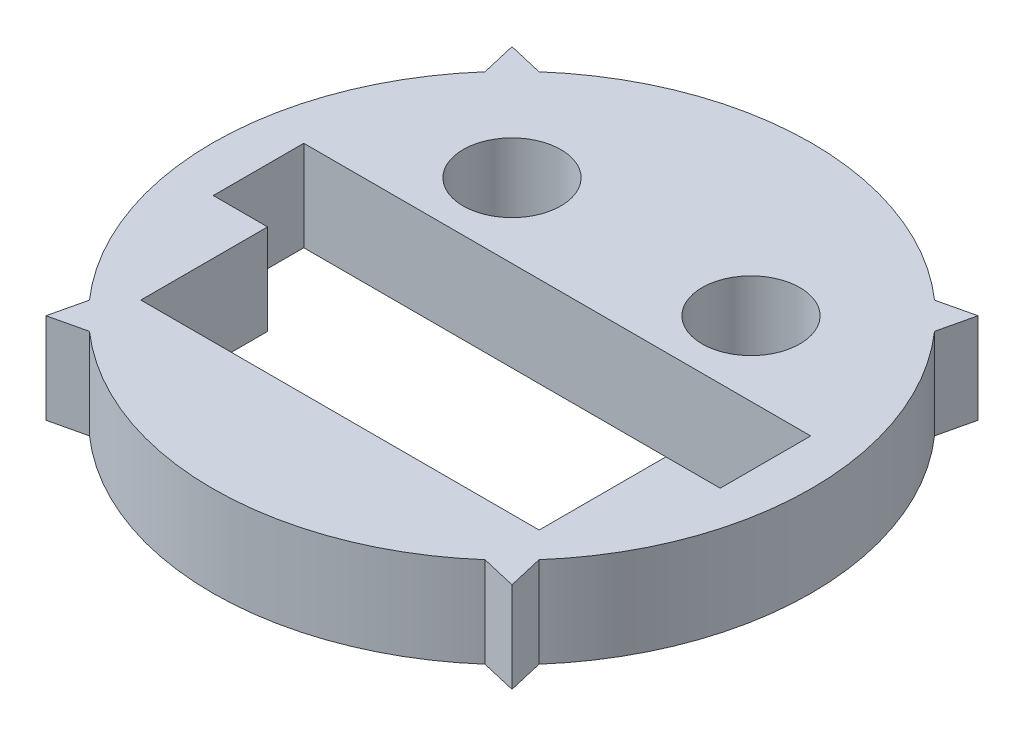
ISO-10303-21;
HEADER;
FILE_DESCRIPTION(('STEP AP214'),'2;1');
FILE_NAME('part.step','',(''),(''),'','','');
FILE_SCHEMA(('AUTOMOTIVE_DESIGN { 1 0 10303 214 1 1 1 1 }'));
ENDSEC;
DATA;
#1=APPLICATION_CONTEXT('core data for automotive mechanical design processes');
#2=APPLICATION_PROTOCOL_DEFINITION('international standard','automotive_design',2000,#1);
#3=PRODUCT_CONTEXT('',#1,'mechanical');
#4=PRODUCT('Part','Part','',(#3));
#5=PRODUCT_RELATED_PRODUCT_CATEGORY('part','',(#4));
#6=PRODUCT_DEFINITION_FORMATION('','',#4);
#7=PRODUCT_DEFINITION_CONTEXT('part definition',#1,'design');
#8=PRODUCT_DEFINITION('design','',#6,#7);
#9=PRODUCT_DEFINITION_SHAPE('','',#8);
#10=(LENGTH_UNIT() NAMED_UNIT(*) SI_UNIT(.MILLI.,.METRE.));
#11=(NAMED_UNIT(*) PLANE_ANGLE_UNIT() SI_UNIT($,.RADIAN.));
#12=(NAMED_UNIT(*) SI_UNIT($,.STERADIAN.) SOLID_ANGLE_UNIT());
#13=UNCERTAINTY_MEASURE_WITH_UNIT(LENGTH_MEASURE(1.E-05),#10,'distance_accuracy_value','');
#14=(GEOMETRIC_REPRESENTATION_CONTEXT(3) GLOBAL_UNCERTAINTY_ASSIGNED_CONTEXT((#13)) GLOBAL_UNIT_ASSIGNED_CONTEXT((#10,
#11,#12)) REPRESENTATION_CONTEXT('',''));
#15=CARTESIAN_POINT('',(0.,0.,0.));
#16=DIRECTION('',(0.,0.,1.));
#17=DIRECTION('',(1.,0.,0.));
#18=AXIS2_PLACEMENT_3D('',#15,#16,#17);
#19=CARTESIAN_POINT('',(0.,6.35,0.));
#20=DIRECTION('',(0.,1.,0.));
#21=DIRECTION('',(0.,0.,1.));
#22=AXIS2_PLACEMENT_3D('',#19,#20,#21);
#23=PLANE('',#22);
#24=CARTESIAN_POINT('',(-8.382,6.35,-8.382));
#25=DIRECTION('',(0.,1.,0.));
#26=DIRECTION('',(0.,0.,1.));
#27=AXIS2_PLACEMENT_3D('',#24,#25,#26);
#28=CIRCLE('',#27,3.429);
#29=CARTESIAN_POINT('',(-8.382,6.35,-4.953));
#30=VERTEX_POINT('',#29);
#31=EDGE_CURVE('E228',#30,#30,#28,.T.);
#32=ORIENTED_EDGE('',*,*,#31,.F.);
#33=EDGE_LOOP('',(#32));
#34=FACE_BOUND('',#33,.T.);
#35=CARTESIAN_POINT('',(0.,6.35,0.));
#36=DIRECTION('',(0.,1.,0.));
#37=DIRECTION('',(0.,0.,1.));
#38=AXIS2_PLACEMENT_3D('',#35,#36,#37);
#39=CIRCLE('',#38,21.);
#40=CARTESIAN_POINT('',(13.8700852365894,6.35,-15.767711803865));
#41=VERTEX_POINT('',#40);
#42=CARTESIAN_POINT('',(-13.8700852365893,6.35,-15.7677118038652));
#43=VERTEX_POINT('',#42);
#44=EDGE_CURVE('E258',#41,#43,#39,.T.);
#45=ORIENTED_EDGE('',*,*,#44,.T.);
#46=DIRECTION('',(-0.973932989200464,0.,-0.22683591546986));
#47=VECTOR('',#46,1.);
#48=CARTESIAN_POINT('',(-16.3438750291584,6.35,-16.3438750291586));
#49=LINE('',#48,#47);
#50=CARTESIAN_POINT('',(-16.3438750291584,6.35,-16.3438750291586));
#51=VERTEX_POINT('',#50);
#52=EDGE_CURVE('E263',#43,#51,#49,.T.);
#53=ORIENTED_EDGE('',*,*,#52,.T.);
#54=DIRECTION('',(0.22683591546985,0.,0.973932989200466));
#55=VECTOR('',#54,1.);
#56=CARTESIAN_POINT('',(-15.767711803865,6.35,-13.8700852365894));
#57=LINE('',#56,#55);
#58=CARTESIAN_POINT('',(-15.767711803865,6.35,-13.8700852365894));
#59=VERTEX_POINT('',#58);
#60=EDGE_CURVE('E275',#51,#59,#57,.T.);
#61=ORIENTED_EDGE('',*,*,#60,.T.);
#62=CARTESIAN_POINT('',(0.,6.35,0.));
#63=DIRECTION('',(0.,1.,0.));
#64=DIRECTION('',(0.,0.,1.));
#65=AXIS2_PLACEMENT_3D('',#62,#63,#64);
#66=CIRCLE('',#65,21.);
#67=CARTESIAN_POINT('',(-15.7677118038652,6.35,13.8700852365893));
#68=VERTEX_POINT('',#67);
#69=EDGE_CURVE('E278',#59,#68,#66,.T.);
#70=ORIENTED_EDGE('',*,*,#69,.T.);
#71=DIRECTION('',(-0.226835915469858,0.,0.973932989200464));
#72=VECTOR('',#71,1.);
#73=CARTESIAN_POINT('',(-16.3438750291586,6.35,16.3438750291584));
#74=LINE('',#73,#72);
#75=CARTESIAN_POINT('',(-16.3438750291586,6.35,16.3438750291584));
#76=VERTEX_POINT('',#75);
#77=EDGE_CURVE('E282',#68,#76,#74,.T.);
#78=ORIENTED_EDGE('',*,*,#77,.T.);
#79=DIRECTION('',(0.973932989200466,0.,-0.22683591546985));
#80=VECTOR('',#79,1.);
#81=CARTESIAN_POINT('',(-13.8700852365894,6.35,15.767711803865));
#82=LINE('',#81,#80);
#83=CARTESIAN_POINT('',(-13.8700852365894,6.35,15.767711803865));
#84=VERTEX_POINT('',#83);
#85=EDGE_CURVE('E286',#76,#84,#82,.T.);
#86=ORIENTED_EDGE('',*,*,#85,.T.);
#87=CARTESIAN_POINT('',(0.,6.35,0.));
#88=DIRECTION('',(0.,1.,0.));
#89=DIRECTION('',(0.,0.,1.));
#90=AXIS2_PLACEMENT_3D('',#87,#88,#89);
#91=CIRCLE('',#90,21.);
#92=CARTESIAN_POINT('',(13.8700852365893,6.35,15.7677118038652));
#93=VERTEX_POINT('',#92);
#94=EDGE_CURVE('E294',#84,#93,#91,.T.);
#95=ORIENTED_EDGE('',*,*,#94,.T.);
#96=DIRECTION('',(0.973932989200464,0.,0.226835915469859));
#97=VECTOR('',#96,1.);
#98=CARTESIAN_POINT('',(16.3438750291584,6.35,16.3438750291586));
#99=LINE('',#98,#97);
#100=CARTESIAN_POINT('',(16.3438750291584,6.35,16.3438750291586));
#101=VERTEX_POINT('',#100);
#102=EDGE_CURVE('E297',#93,#101,#99,.T.);
#103=ORIENTED_EDGE('',*,*,#102,.T.);
#104=DIRECTION('',(-0.226835915469849,0.,-0.973932989200466));
#105=VECTOR('',#104,1.);
#106=CARTESIAN_POINT('',(15.767711803865,6.35,13.8700852365894));
#107=LINE('',#106,#105);
#108=CARTESIAN_POINT('',(15.767711803865,6.35,13.8700852365894));
#109=VERTEX_POINT('',#108);
#110=EDGE_CURVE('E301',#101,#109,#107,.T.);
#111=ORIENTED_EDGE('',*,*,#110,.T.);
#112=CARTESIAN_POINT('',(0.,6.35,0.));
#113=DIRECTION('',(0.,1.,0.));
#114=DIRECTION('',(0.,0.,1.));
#115=AXIS2_PLACEMENT_3D('',#112,#113,#114);
#116=CIRCLE('',#115,21.);
#117=CARTESIAN_POINT('',(15.7677118038652,6.35,-13.8700852365893));
#118=VERTEX_POINT('',#117);
#119=EDGE_CURVE('E305',#109,#118,#116,.T.);
#120=ORIENTED_EDGE('',*,*,#119,.T.);
#121=DIRECTION('',(0.226835915469859,0.,-0.973932989200464));
#122=VECTOR('',#121,1.);
#123=CARTESIAN_POINT('',(16.3438750291586,6.35,-16.3438750291584));
#124=LINE('',#123,#122);
#125=CARTESIAN_POINT('',(16.3438750291586,6.35,-16.3438750291584));
#126=VERTEX_POINT('',#125);
#127=EDGE_CURVE('E309',#118,#126,#124,.T.);
#128=ORIENTED_EDGE('',*,*,#127,.T.);
#129=DIRECTION('',(-0.973932989200466,0.,0.226835915469849));
#130=VECTOR('',#129,1.);
#131=CARTESIAN_POINT('',(13.8700852365894,6.35,-15.767711803865));
#132=LINE('',#131,#130);
#133=EDGE_CURVE('E312',#126,#41,#132,.T.);
#134=ORIENTED_EDGE('',*,*,#133,.T.);
#135=EDGE_LOOP('',(#45,#53,#61,#70,#78,#86,#95,#103,#111,#120,#128,#134));
#136=FACE_BOUND('',#135,.T.);
#137=DIRECTION('',(1.,0.,0.));
#138=VECTOR('',#137,1.);
#139=CARTESIAN_POINT('',(-17.78,6.35,3.175));
#140=LINE('',#139,#138);
#141=CARTESIAN_POINT('',(-17.78,6.35,3.175));
#142=VERTEX_POINT('',#141);
#143=CARTESIAN_POINT('',(-13.97,6.35,3.175));
#144=VERTEX_POINT('',#143);
#145=EDGE_CURVE('E184',#142,#144,#140,.T.);
#146=ORIENTED_EDGE('',*,*,#145,.F.);
#147=DIRECTION('',(0.,0.,1.));
#148=VECTOR('',#147,1.);
#149=CARTESIAN_POINT('',(-17.78,6.35,-3.175));
#150=LINE('',#149,#148);
#151=CARTESIAN_POINT('',(-17.78,6.35,-3.175));
#152=VERTEX_POINT('',#151);
#153=EDGE_CURVE('E175',#152,#142,#150,.T.);
#154=ORIENTED_EDGE('',*,*,#153,.F.);
#155=DIRECTION('',(-1.,0.,0.));
#156=VECTOR('',#155,1.);
#157=CARTESIAN_POINT('',(-17.78,6.35,-3.175));
#158=LINE('',#157,#156);
#159=CARTESIAN_POINT('',(17.78,6.35,-3.175));
#160=VERTEX_POINT('',#159);
#161=EDGE_CURVE('E220',#160,#152,#158,.T.);
#162=ORIENTED_EDGE('',*,*,#161,.F.);
#163=DIRECTION('',(0.,0.,-1.));
#164=VECTOR('',#163,1.);
#165=CARTESIAN_POINT('',(17.78,6.35,-3.175));
#166=LINE('',#165,#164);
#167=CARTESIAN_POINT('',(17.78,6.35,3.175));
#168=VERTEX_POINT('',#167);
#169=EDGE_CURVE('E224',#168,#160,#166,.T.);
#170=ORIENTED_EDGE('',*,*,#169,.F.);
#171=DIRECTION('',(1.,0.,0.));
#172=VECTOR('',#171,1.);
#173=CARTESIAN_POINT('',(13.97,6.35,3.175));
#174=LINE('',#173,#172);
#175=CARTESIAN_POINT('',(13.97,6.35,3.175));
#176=VERTEX_POINT('',#175);
#177=EDGE_CURVE('E655',#176,#168,#174,.T.);
#178=ORIENTED_EDGE('',*,*,#177,.F.);
#179=DIRECTION('',(0.,0.,-1.));
#180=VECTOR('',#179,1.);
#181=CARTESIAN_POINT('',(13.97,6.35,3.175));
#182=LINE('',#181,#180);
#183=CARTESIAN_POINT('',(13.97,6.35,12.065));
#184=VERTEX_POINT('',#183);
#185=EDGE_CURVE('E653',#184,#176,#182,.T.);
#186=ORIENTED_EDGE('',*,*,#185,.F.);
#187=DIRECTION('',(1.,0.,0.));
#188=VECTOR('',#187,1.);
#189=CARTESIAN_POINT('',(-13.97,6.35,12.065));
#190=LINE('',#189,#188);
#191=CARTESIAN_POINT('',(-13.97,6.35,12.065));
#192=VERTEX_POINT('',#191);
#193=EDGE_CURVE('E203',#192,#184,#190,.T.);
#194=ORIENTED_EDGE('',*,*,#193,.F.);
#195=DIRECTION('',(0.,0.,1.));
#196=VECTOR('',#195,1.);
#197=CARTESIAN_POINT('',(-13.97,6.35,3.175));
#198=LINE('',#197,#196);
#199=EDGE_CURVE('E198',#144,#192,#198,.T.);
#200=ORIENTED_EDGE('',*,*,#199,.F.);
#201=EDGE_LOOP('',(#146,#154,#162,#170,#178,#186,#194,#200));
#202=FACE_BOUND('',#201,.T.);
#203=CARTESIAN_POINT('',(8.382,6.35,-8.382));
#204=DIRECTION('',(0.,1.,0.));
#205=DIRECTION('',(0.,0.,1.));
#206=AXIS2_PLACEMENT_3D('',#203,#204,#205);
#207=CIRCLE('',#206,3.429);
#208=CARTESIAN_POINT('',(8.382,6.35,-4.953));
#209=VERTEX_POINT('',#208);
#210=EDGE_CURVE('E636',#209,#209,#207,.T.);
#211=ORIENTED_EDGE('',*,*,#210,.F.);
#212=EDGE_LOOP('',(#211));
#213=FACE_BOUND('',#212,.T.);
#214=ADVANCED_FACE('F38',(#34,#136,#202,#213),#23,.T.);
#215=CARTESIAN_POINT('',(0.,0.,0.));
#216=DIRECTION('',(0.,1.,0.));
#217=DIRECTION('',(0.,0.,1.));
#218=AXIS2_PLACEMENT_3D('',#215,#216,#217);
#219=PLANE('',#218);
#220=CARTESIAN_POINT('',(0.,0.,0.));
#221=DIRECTION('',(0.,1.,0.));
#222=DIRECTION('',(0.,0.,1.));
#223=AXIS2_PLACEMENT_3D('',#220,#221,#222);
#224=CIRCLE('',#223,21.);
#225=CARTESIAN_POINT('',(13.8700852365894,0.,-15.767711803865));
#226=VERTEX_POINT('',#225);
#227=CARTESIAN_POINT('',(-13.8700852365893,0.,-15.7677118038652));
#228=VERTEX_POINT('',#227);
#229=EDGE_CURVE('E192',#226,#228,#224,.T.);
#230=ORIENTED_EDGE('',*,*,#229,.F.);
#231=DIRECTION('',(-0.973932989200466,0.,0.226835915469849));
#232=VECTOR('',#231,1.);
#233=CARTESIAN_POINT('',(13.8700852365894,0.,-15.767711803865));
#234=LINE('',#233,#232);
#235=CARTESIAN_POINT('',(16.3438750291586,0.,-16.3438750291584));
#236=VERTEX_POINT('',#235);
#237=EDGE_CURVE('E264',#236,#226,#234,.T.);
#238=ORIENTED_EDGE('',*,*,#237,.F.);
#239=DIRECTION('',(0.226835915469859,0.,-0.973932989200464));
#240=VECTOR('',#239,1.);
#241=CARTESIAN_POINT('',(16.3438750291586,0.,-16.3438750291584));
#242=LINE('',#241,#240);
#243=CARTESIAN_POINT('',(15.7677118038652,0.,-13.8700852365893));
#244=VERTEX_POINT('',#243);
#245=EDGE_CURVE('E336',#244,#236,#242,.T.);
#246=ORIENTED_EDGE('',*,*,#245,.F.);
#247=CARTESIAN_POINT('',(0.,0.,0.));
#248=DIRECTION('',(0.,1.,0.));
#249=DIRECTION('',(0.,0.,1.));
#250=AXIS2_PLACEMENT_3D('',#247,#248,#249);
#251=CIRCLE('',#250,21.);
#252=CARTESIAN_POINT('',(15.767711803865,0.,13.8700852365894));
#253=VERTEX_POINT('',#252);
#254=EDGE_CURVE('E334',#253,#244,#251,.T.);
#255=ORIENTED_EDGE('',*,*,#254,.F.);
#256=DIRECTION('',(-0.226835915469849,0.,-0.973932989200466));
#257=VECTOR('',#256,1.);
#258=CARTESIAN_POINT('',(15.767711803865,0.,13.8700852365894));
#259=LINE('',#258,#257);
#260=CARTESIAN_POINT('',(16.3438750291584,0.,16.3438750291586));
#261=VERTEX_POINT('',#260);
#262=EDGE_CURVE('E332',#261,#253,#259,.T.);
#263=ORIENTED_EDGE('',*,*,#262,.F.);
#264=DIRECTION('',(0.973932989200464,0.,0.226835915469859));
#265=VECTOR('',#264,1.);
#266=CARTESIAN_POINT('',(16.3438750291584,0.,16.3438750291586));
#267=LINE('',#266,#265);
#268=CARTESIAN_POINT('',(13.8700852365893,0.,15.7677118038652));
#269=VERTEX_POINT('',#268);
#270=EDGE_CURVE('E330',#269,#261,#267,.T.);
#271=ORIENTED_EDGE('',*,*,#270,.F.);
#272=CARTESIAN_POINT('',(0.,0.,0.));
#273=DIRECTION('',(0.,1.,0.));
#274=DIRECTION('',(0.,0.,1.));
#275=AXIS2_PLACEMENT_3D('',#272,#273,#274);
#276=CIRCLE('',#275,21.);
#277=CARTESIAN_POINT('',(-13.8700852365894,0.,15.767711803865));
#278=VERTEX_POINT('',#277);
#279=EDGE_CURVE('E328',#278,#269,#276,.T.);
#280=ORIENTED_EDGE('',*,*,#279,.F.);
#281=DIRECTION('',(0.973932989200466,0.,-0.22683591546985));
#282=VECTOR('',#281,1.);
#283=CARTESIAN_POINT('',(-13.8700852365894,0.,15.767711803865));
#284=LINE('',#283,#282);
#285=CARTESIAN_POINT('',(-16.3438750291586,0.,16.3438750291584));
#286=VERTEX_POINT('',#285);
#287=EDGE_CURVE('E326',#286,#278,#284,.T.);
#288=ORIENTED_EDGE('',*,*,#287,.F.);
#289=DIRECTION('',(-0.226835915469858,0.,0.973932989200464));
#290=VECTOR('',#289,1.);
#291=CARTESIAN_POINT('',(-16.3438750291586,0.,16.3438750291584));
#292=LINE('',#291,#290);
#293=CARTESIAN_POINT('',(-15.7677118038652,0.,13.8700852365893));
#294=VERTEX_POINT('',#293);
#295=EDGE_CURVE('E324',#294,#286,#292,.T.);
#296=ORIENTED_EDGE('',*,*,#295,.F.);
#297=CARTESIAN_POINT('',(0.,0.,0.));
#298=DIRECTION('',(0.,1.,0.));
#299=DIRECTION('',(0.,0.,1.));
#300=AXIS2_PLACEMENT_3D('',#297,#298,#299);
#301=CIRCLE('',#300,21.);
#302=CARTESIAN_POINT('',(-15.767711803865,0.,-13.8700852365894));
#303=VERTEX_POINT('',#302);
#304=EDGE_CURVE('E322',#303,#294,#301,.T.);
#305=ORIENTED_EDGE('',*,*,#304,.F.);
#306=DIRECTION('',(0.22683591546985,0.,0.973932989200466));
#307=VECTOR('',#306,1.);
#308=CARTESIAN_POINT('',(-15.767711803865,0.,-13.8700852365894));
#309=LINE('',#308,#307);
#310=CARTESIAN_POINT('',(-16.3438750291584,0.,-16.3438750291586));
#311=VERTEX_POINT('',#310);
#312=EDGE_CURVE('E320',#311,#303,#309,.T.);
#313=ORIENTED_EDGE('',*,*,#312,.F.);
#314=DIRECTION('',(-0.973932989200464,0.,-0.22683591546986));
#315=VECTOR('',#314,1.);
#316=CARTESIAN_POINT('',(-16.3438750291584,0.,-16.3438750291586));
#317=LINE('',#316,#315);
#318=EDGE_CURVE('E318',#228,#311,#317,.T.);
#319=ORIENTED_EDGE('',*,*,#318,.F.);
#320=EDGE_LOOP('',(#230,#238,#246,#255,#263,#271,#280,#288,#296,#305,#313,#319));
#321=FACE_BOUND('',#320,.T.);
#322=DIRECTION('',(0.,0.,1.));
#323=VECTOR('',#322,1.);
#324=CARTESIAN_POINT('',(-17.78,0.,-3.175));
#325=LINE('',#324,#323);
#326=CARTESIAN_POINT('',(-17.78,0.,-3.175));
#327=VERTEX_POINT('',#326);
#328=CARTESIAN_POINT('',(-17.78,0.,3.175));
#329=VERTEX_POINT('',#328);
#330=EDGE_CURVE('E61',#327,#329,#325,.T.);
#331=ORIENTED_EDGE('',*,*,#330,.T.);
#332=DIRECTION('',(1.,0.,0.));
#333=VECTOR('',#332,1.);
#334=CARTESIAN_POINT('',(-17.78,0.,3.175));
#335=LINE('',#334,#333);
#336=CARTESIAN_POINT('',(-13.97,0.,3.175));
#337=VERTEX_POINT('',#336);
#338=EDGE_CURVE('E191',#329,#337,#335,.T.);
#339=ORIENTED_EDGE('',*,*,#338,.T.);
#340=DIRECTION('',(0.,0.,1.));
#341=VECTOR('',#340,1.);
#342=CARTESIAN_POINT('',(-13.97,0.,3.175));
#343=LINE('',#342,#341);
#344=CARTESIAN_POINT('',(-13.97,0.,12.065));
#345=VERTEX_POINT('',#344);
#346=EDGE_CURVE('E230',#337,#345,#343,.T.);
#347=ORIENTED_EDGE('',*,*,#346,.T.);
#348=DIRECTION('',(1.,0.,0.));
#349=VECTOR('',#348,1.);
#350=CARTESIAN_POINT('',(-13.97,0.,12.065));
#351=LINE('',#350,#349);
#352=CARTESIAN_POINT('',(13.97,0.,12.065));
#353=VERTEX_POINT('',#352);
#354=EDGE_CURVE('E233',#345,#353,#351,.T.);
#355=ORIENTED_EDGE('',*,*,#354,.T.);
#356=DIRECTION('',(0.,0.,-1.));
#357=VECTOR('',#356,1.);
#358=CARTESIAN_POINT('',(13.97,0.,3.175));
#359=LINE('',#358,#357);
#360=CARTESIAN_POINT('',(13.97,0.,3.175));
#361=VERTEX_POINT('',#360);
#362=EDGE_CURVE('E236',#353,#361,#359,.T.);
#363=ORIENTED_EDGE('',*,*,#362,.T.);
#364=DIRECTION('',(1.,0.,0.));
#365=VECTOR('',#364,1.);
#366=CARTESIAN_POINT('',(13.97,0.,3.175));
#367=LINE('',#366,#365);
#368=CARTESIAN_POINT('',(17.78,0.,3.175));
#369=VERTEX_POINT('',#368);
#370=EDGE_CURVE('E239',#361,#369,#367,.T.);
#371=ORIENTED_EDGE('',*,*,#370,.T.);
#372=DIRECTION('',(0.,0.,-1.));
#373=VECTOR('',#372,1.);
#374=CARTESIAN_POINT('',(17.78,0.,-3.175));
#375=LINE('',#374,#373);
#376=CARTESIAN_POINT('',(17.78,0.,-3.175));
#377=VERTEX_POINT('',#376);
#378=EDGE_CURVE('E242',#369,#377,#375,.T.);
#379=ORIENTED_EDGE('',*,*,#378,.T.);
#380=DIRECTION('',(-1.,0.,0.));
#381=VECTOR('',#380,1.);
#382=CARTESIAN_POINT('',(-17.78,0.,-3.175));
#383=LINE('',#382,#381);
#384=EDGE_CURVE('E185',#377,#327,#383,.T.);
#385=ORIENTED_EDGE('',*,*,#384,.T.);
#386=EDGE_LOOP('',(#331,#339,#347,#355,#363,#371,#379,#385));
#387=FACE_BOUND('',#386,.T.);
#388=CARTESIAN_POINT('',(-8.382,0.,-8.382));
#389=DIRECTION('',(0.,1.,0.));
#390=DIRECTION('',(0.,0.,1.));
#391=AXIS2_PLACEMENT_3D('',#388,#389,#390);
#392=CIRCLE('',#391,3.429);
#393=CARTESIAN_POINT('',(-8.382,0.,-4.953));
#394=VERTEX_POINT('',#393);
#395=EDGE_CURVE('E643',#394,#394,#392,.T.);
#396=ORIENTED_EDGE('',*,*,#395,.T.);
#397=EDGE_LOOP('',(#396));
#398=FACE_BOUND('',#397,.T.);
#399=CARTESIAN_POINT('',(8.382,0.,-8.382));
#400=DIRECTION('',(0.,1.,0.));
#401=DIRECTION('',(0.,0.,1.));
#402=AXIS2_PLACEMENT_3D('',#399,#400,#401);
#403=CIRCLE('',#402,3.429);
#404=CARTESIAN_POINT('',(8.382,0.,-4.953));
#405=VERTEX_POINT('',#404);
#406=EDGE_CURVE('E639',#405,#405,#403,.T.);
#407=ORIENTED_EDGE('',*,*,#406,.T.);
#408=EDGE_LOOP('',(#407));
#409=FACE_BOUND('',#408,.T.);
#410=ADVANCED_FACE('F378',(#321,#387,#398,#409),#219,.F.);
#411=CARTESIAN_POINT('',(0.,6.35,0.));
#412=DIRECTION('',(0.,-1.,0.));
#413=DIRECTION('',(0.,0.,-1.));
#414=AXIS2_PLACEMENT_3D('',#411,#412,#413);
#415=CYLINDRICAL_SURFACE('',#414,21.);
#416=ORIENTED_EDGE('',*,*,#229,.T.);
#417=DIRECTION('',(0.,-1.,0.));
#418=VECTOR('',#417,1.);
#419=CARTESIAN_POINT('',(-13.8700852365893,6.35,-15.7677118038652));
#420=LINE('',#419,#418);
#421=EDGE_CURVE('E12',#43,#228,#420,.T.);
#422=ORIENTED_EDGE('',*,*,#421,.F.);
#423=ORIENTED_EDGE('',*,*,#44,.F.);
#424=DIRECTION('',(0.,-1.,0.));
#425=VECTOR('',#424,1.);
#426=CARTESIAN_POINT('',(13.8700852365894,6.35,-15.767711803865));
#427=LINE('',#426,#425);
#428=EDGE_CURVE('E315',#41,#226,#427,.T.);
#429=ORIENTED_EDGE('',*,*,#428,.T.);
#430=EDGE_LOOP('',(#416,#422,#423,#429));
#431=FACE_BOUND('',#430,.T.);
#432=ADVANCED_FACE('F40',(#431),#415,.T.);
#433=CARTESIAN_POINT('',(-16.3438750291584,6.35,-16.3438750291586));
#434=DIRECTION('',(-0.22683591546986,0.,0.973932989200464));
#435=DIRECTION('',(0.973932989200464,0.,0.22683591546986));
#436=AXIS2_PLACEMENT_3D('',#433,#434,#435);
#437=PLANE('',#436);
#438=ORIENTED_EDGE('',*,*,#318,.T.);
#439=DIRECTION('',(0.,-1.,0.));
#440=VECTOR('',#439,1.);
#441=CARTESIAN_POINT('',(-16.3438750291584,6.35,-16.3438750291586));
#442=LINE('',#441,#440);
#443=EDGE_CURVE('E46',#51,#311,#442,.T.);
#444=ORIENTED_EDGE('',*,*,#443,.F.);
#445=ORIENTED_EDGE('',*,*,#52,.F.);
#446=ORIENTED_EDGE('',*,*,#421,.T.);
#447=EDGE_LOOP('',(#438,#444,#445,#446));
#448=FACE_BOUND('',#447,.T.);
#449=ADVANCED_FACE('F417',(#448),#437,.F.);
#450=CARTESIAN_POINT('',(-15.767711803865,6.35,-13.8700852365894));
#451=DIRECTION('',(0.973932989200466,0.,-0.22683591546985));
#452=DIRECTION('',(-0.22683591546985,0.,-0.973932989200466));
#453=AXIS2_PLACEMENT_3D('',#450,#451,#452);
#454=PLANE('',#453);
#455=ORIENTED_EDGE('',*,*,#312,.T.);
#456=DIRECTION('',(0.,-1.,0.));
#457=VECTOR('',#456,1.);
#458=CARTESIAN_POINT('',(-15.767711803865,6.35,-13.8700852365894));
#459=LINE('',#458,#457);
#460=EDGE_CURVE('E365',#59,#303,#459,.T.);
#461=ORIENTED_EDGE('',*,*,#460,.F.);
#462=ORIENTED_EDGE('',*,*,#60,.F.);
#463=ORIENTED_EDGE('',*,*,#443,.T.);
#464=EDGE_LOOP('',(#455,#461,#462,#463));
#465=FACE_BOUND('',#464,.T.);
#466=ADVANCED_FACE('F372',(#465),#454,.F.);
#467=CARTESIAN_POINT('',(0.,6.35,0.));
#468=DIRECTION('',(0.,-1.,0.));
#469=DIRECTION('',(0.,0.,-1.));
#470=AXIS2_PLACEMENT_3D('',#467,#468,#469);
#471=CYLINDRICAL_SURFACE('',#470,21.);
#472=ORIENTED_EDGE('',*,*,#304,.T.);
#473=DIRECTION('',(0.,-1.,0.));
#474=VECTOR('',#473,1.);
#475=CARTESIAN_POINT('',(-15.7677118038652,6.35,13.8700852365893));
#476=LINE('',#475,#474);
#477=EDGE_CURVE('E362',#68,#294,#476,.T.);
#478=ORIENTED_EDGE('',*,*,#477,.F.);
#479=ORIENTED_EDGE('',*,*,#69,.F.);
#480=ORIENTED_EDGE('',*,*,#460,.T.);
#481=EDGE_LOOP('',(#472,#478,#479,#480));
#482=FACE_BOUND('',#481,.T.);
#483=ADVANCED_FACE('F384',(#482),#471,.T.);
#484=CARTESIAN_POINT('',(-16.3438750291586,6.35,16.3438750291584));
#485=DIRECTION('',(0.973932989200464,0.,0.226835915469858));
#486=DIRECTION('',(0.226835915469858,0.,-0.973932989200464));
#487=AXIS2_PLACEMENT_3D('',#484,#485,#486);
#488=PLANE('',#487);
#489=ORIENTED_EDGE('',*,*,#295,.T.);
#490=DIRECTION('',(0.,-1.,0.));
#491=VECTOR('',#490,1.);
#492=CARTESIAN_POINT('',(-16.3438750291586,6.35,16.3438750291584));
#493=LINE('',#492,#491);
#494=EDGE_CURVE('E359',#76,#286,#493,.T.);
#495=ORIENTED_EDGE('',*,*,#494,.F.);
#496=ORIENTED_EDGE('',*,*,#77,.F.);
#497=ORIENTED_EDGE('',*,*,#477,.T.);
#498=EDGE_LOOP('',(#489,#495,#496,#497));
#499=FACE_BOUND('',#498,.T.);
#500=ADVANCED_FACE('F388',(#499),#488,.F.);
#501=CARTESIAN_POINT('',(-13.8700852365894,6.35,15.767711803865));
#502=DIRECTION('',(-0.22683591546985,0.,-0.973932989200466));
#503=DIRECTION('',(-0.973932989200466,0.,0.22683591546985));
#504=AXIS2_PLACEMENT_3D('',#501,#502,#503);
#505=PLANE('',#504);
#506=ORIENTED_EDGE('',*,*,#287,.T.);
#507=DIRECTION('',(0.,-1.,0.));
#508=VECTOR('',#507,1.);
#509=CARTESIAN_POINT('',(-13.8700852365894,6.35,15.767711803865));
#510=LINE('',#509,#508);
#511=EDGE_CURVE('E356',#84,#278,#510,.T.);
#512=ORIENTED_EDGE('',*,*,#511,.F.);
#513=ORIENTED_EDGE('',*,*,#85,.F.);
#514=ORIENTED_EDGE('',*,*,#494,.T.);
#515=EDGE_LOOP('',(#506,#512,#513,#514));
#516=FACE_BOUND('',#515,.T.);
#517=ADVANCED_FACE('F452',(#516),#505,.F.);
#518=CARTESIAN_POINT('',(0.,6.35,0.));
#519=DIRECTION('',(0.,-1.,0.));
#520=DIRECTION('',(0.,0.,-1.));
#521=AXIS2_PLACEMENT_3D('',#518,#519,#520);
#522=CYLINDRICAL_SURFACE('',#521,21.);
#523=ORIENTED_EDGE('',*,*,#279,.T.);
#524=DIRECTION('',(0.,-1.,0.));
#525=VECTOR('',#524,1.);
#526=CARTESIAN_POINT('',(13.8700852365893,6.35,15.7677118038652));
#527=LINE('',#526,#525);
#528=EDGE_CURVE('E353',#93,#269,#527,.T.);
#529=ORIENTED_EDGE('',*,*,#528,.F.);
#530=ORIENTED_EDGE('',*,*,#94,.F.);
#531=ORIENTED_EDGE('',*,*,#511,.T.);
#532=EDGE_LOOP('',(#523,#529,#530,#531));
#533=FACE_BOUND('',#532,.T.);
#534=ADVANCED_FACE('F448',(#533),#522,.T.);
#535=CARTESIAN_POINT('',(16.3438750291584,6.35,16.3438750291586));
#536=DIRECTION('',(0.226835915469859,0.,-0.973932989200464));
#537=DIRECTION('',(-0.973932989200464,0.,-0.226835915469859));
#538=AXIS2_PLACEMENT_3D('',#535,#536,#537);
#539=PLANE('',#538);
#540=ORIENTED_EDGE('',*,*,#270,.T.);
#541=DIRECTION('',(0.,-1.,0.));
#542=VECTOR('',#541,1.);
#543=CARTESIAN_POINT('',(16.3438750291584,6.35,16.3438750291586));
#544=LINE('',#543,#542);
#545=EDGE_CURVE('E350',#101,#261,#544,.T.);
#546=ORIENTED_EDGE('',*,*,#545,.F.);
#547=ORIENTED_EDGE('',*,*,#102,.F.);
#548=ORIENTED_EDGE('',*,*,#528,.T.);
#549=EDGE_LOOP('',(#540,#546,#547,#548));
#550=FACE_BOUND('',#549,.T.);
#551=ADVANCED_FACE('F444',(#550),#539,.F.);
#552=CARTESIAN_POINT('',(15.767711803865,6.35,13.8700852365894));
#553=DIRECTION('',(-0.973932989200466,0.,0.226835915469849));
#554=DIRECTION('',(0.226835915469849,0.,0.973932989200466));
#555=AXIS2_PLACEMENT_3D('',#552,#553,#554);
#556=PLANE('',#555);
#557=ORIENTED_EDGE('',*,*,#262,.T.);
#558=DIRECTION('',(0.,-1.,0.));
#559=VECTOR('',#558,1.);
#560=CARTESIAN_POINT('',(15.767711803865,6.35,13.8700852365894));
#561=LINE('',#560,#559);
#562=EDGE_CURVE('E347',#109,#253,#561,.T.);
#563=ORIENTED_EDGE('',*,*,#562,.F.);
#564=ORIENTED_EDGE('',*,*,#110,.F.);
#565=ORIENTED_EDGE('',*,*,#545,.T.);
#566=EDGE_LOOP('',(#557,#563,#564,#565));
#567=FACE_BOUND('',#566,.T.);
#568=ADVANCED_FACE('F441',(#567),#556,.F.);
#569=CARTESIAN_POINT('',(0.,6.35,0.));
#570=DIRECTION('',(0.,-1.,0.));
#571=DIRECTION('',(0.,0.,-1.));
#572=AXIS2_PLACEMENT_3D('',#569,#570,#571);
#573=CYLINDRICAL_SURFACE('',#572,21.);
#574=ORIENTED_EDGE('',*,*,#254,.T.);
#575=DIRECTION('',(0.,-1.,0.));
#576=VECTOR('',#575,1.);
#577=CARTESIAN_POINT('',(15.7677118038652,6.35,-13.8700852365893));
#578=LINE('',#577,#576);
#579=EDGE_CURVE('E344',#118,#244,#578,.T.);
#580=ORIENTED_EDGE('',*,*,#579,.F.);
#581=ORIENTED_EDGE('',*,*,#119,.F.);
#582=ORIENTED_EDGE('',*,*,#562,.T.);
#583=EDGE_LOOP('',(#574,#580,#581,#582));
#584=FACE_BOUND('',#583,.T.);
#585=ADVANCED_FACE('F406',(#584),#573,.T.);
#586=CARTESIAN_POINT('',(16.3438750291586,6.35,-16.3438750291584));
#587=DIRECTION('',(-0.973932989200464,0.,-0.226835915469859));
#588=DIRECTION('',(-0.226835915469859,0.,0.973932989200464));
#589=AXIS2_PLACEMENT_3D('',#586,#587,#588);
#590=PLANE('',#589);
#591=ORIENTED_EDGE('',*,*,#245,.T.);
#592=DIRECTION('',(0.,-1.,0.));
#593=VECTOR('',#592,1.);
#594=CARTESIAN_POINT('',(16.3438750291586,6.35,-16.3438750291584));
#595=LINE('',#594,#593);
#596=EDGE_CURVE('E341',#126,#236,#595,.T.);
#597=ORIENTED_EDGE('',*,*,#596,.F.);
#598=ORIENTED_EDGE('',*,*,#127,.F.);
#599=ORIENTED_EDGE('',*,*,#579,.T.);
#600=EDGE_LOOP('',(#591,#597,#598,#599));
#601=FACE_BOUND('',#600,.T.);
#602=ADVANCED_FACE('F410',(#601),#590,.F.);
#603=CARTESIAN_POINT('',(13.8700852365894,6.35,-15.767711803865));
#604=DIRECTION('',(0.226835915469849,0.,0.973932989200466));
#605=DIRECTION('',(0.973932989200466,0.,-0.226835915469849));
#606=AXIS2_PLACEMENT_3D('',#603,#604,#605);
#607=PLANE('',#606);
#608=ORIENTED_EDGE('',*,*,#237,.T.);
#609=ORIENTED_EDGE('',*,*,#428,.F.);
#610=ORIENTED_EDGE('',*,*,#133,.F.);
#611=ORIENTED_EDGE('',*,*,#596,.T.);
#612=EDGE_LOOP('',(#608,#609,#610,#611));
#613=FACE_BOUND('',#612,.T.);
#614=ADVANCED_FACE('F415',(#613),#607,.F.);
#615=CARTESIAN_POINT('',(-17.78,6.35,-3.175));
#616=DIRECTION('',(1.,0.,0.));
#617=DIRECTION('',(0.,0.,-1.));
#618=AXIS2_PLACEMENT_3D('',#615,#616,#617);
#619=PLANE('',#618);
#620=ORIENTED_EDGE('',*,*,#330,.F.);
#621=DIRECTION('',(0.,-1.,0.));
#622=VECTOR('',#621,1.);
#623=CARTESIAN_POINT('',(-17.78,6.35,-3.175));
#624=LINE('',#623,#622);
#625=EDGE_CURVE('E179',#152,#327,#624,.T.);
#626=ORIENTED_EDGE('',*,*,#625,.F.);
#627=ORIENTED_EDGE('',*,*,#153,.T.);
#628=DIRECTION('',(0.,-1.,0.));
#629=VECTOR('',#628,1.);
#630=CARTESIAN_POINT('',(-17.78,6.35,3.175));
#631=LINE('',#630,#629);
#632=EDGE_CURVE('E178',#142,#329,#631,.T.);
#633=ORIENTED_EDGE('',*,*,#632,.T.);
#634=EDGE_LOOP('',(#620,#626,#627,#633));
#635=FACE_BOUND('',#634,.T.);
#636=ADVANCED_FACE('F177',(#635),#619,.T.);
#637=CARTESIAN_POINT('',(-17.78,6.35,3.175));
#638=DIRECTION('',(0.,0.,-1.));
#639=DIRECTION('',(-1.,0.,0.));
#640=AXIS2_PLACEMENT_3D('',#637,#638,#639);
#641=PLANE('',#640);
#642=ORIENTED_EDGE('',*,*,#338,.F.);
#643=ORIENTED_EDGE('',*,*,#632,.F.);
#644=ORIENTED_EDGE('',*,*,#145,.T.);
#645=DIRECTION('',(0.,-1.,0.));
#646=VECTOR('',#645,1.);
#647=CARTESIAN_POINT('',(-13.97,6.35,3.175));
#648=LINE('',#647,#646);
#649=EDGE_CURVE('E193',#144,#337,#648,.T.);
#650=ORIENTED_EDGE('',*,*,#649,.T.);
#651=EDGE_LOOP('',(#642,#643,#644,#650));
#652=FACE_BOUND('',#651,.T.);
#653=ADVANCED_FACE('F188',(#652),#641,.T.);
#654=CARTESIAN_POINT('',(-13.97,6.35,3.175));
#655=DIRECTION('',(1.,0.,0.));
#656=DIRECTION('',(0.,0.,-1.));
#657=AXIS2_PLACEMENT_3D('',#654,#655,#656);
#658=PLANE('',#657);
#659=ORIENTED_EDGE('',*,*,#346,.F.);
#660=ORIENTED_EDGE('',*,*,#649,.F.);
#661=ORIENTED_EDGE('',*,*,#199,.T.);
#662=DIRECTION('',(0.,-1.,0.));
#663=VECTOR('',#662,1.);
#664=CARTESIAN_POINT('',(-13.97,6.35,12.065));
#665=LINE('',#664,#663);
#666=EDGE_CURVE('E255',#192,#345,#665,.T.);
#667=ORIENTED_EDGE('',*,*,#666,.T.);
#668=EDGE_LOOP('',(#659,#660,#661,#667));
#669=FACE_BOUND('',#668,.T.);
#670=ADVANCED_FACE('F507',(#669),#658,.T.);
#671=CARTESIAN_POINT('',(-13.97,6.35,12.065));
#672=DIRECTION('',(0.,0.,-1.));
#673=DIRECTION('',(-1.,0.,0.));
#674=AXIS2_PLACEMENT_3D('',#671,#672,#673);
#675=PLANE('',#674);
#676=ORIENTED_EDGE('',*,*,#354,.F.);
#677=ORIENTED_EDGE('',*,*,#666,.F.);
#678=ORIENTED_EDGE('',*,*,#193,.T.);
#679=DIRECTION('',(0.,-1.,0.));
#680=VECTOR('',#679,1.);
#681=CARTESIAN_POINT('',(13.97,6.35,12.065));
#682=LINE('',#681,#680);
#683=EDGE_CURVE('E253',#184,#353,#682,.T.);
#684=ORIENTED_EDGE('',*,*,#683,.T.);
#685=EDGE_LOOP('',(#676,#677,#678,#684));
#686=FACE_BOUND('',#685,.T.);
#687=ADVANCED_FACE('F513',(#686),#675,.T.);
#688=CARTESIAN_POINT('',(13.97,6.35,3.175));
#689=DIRECTION('',(-1.,0.,0.));
#690=DIRECTION('',(0.,0.,1.));
#691=AXIS2_PLACEMENT_3D('',#688,#689,#690);
#692=PLANE('',#691);
#693=ORIENTED_EDGE('',*,*,#362,.F.);
#694=ORIENTED_EDGE('',*,*,#683,.F.);
#695=ORIENTED_EDGE('',*,*,#185,.T.);
#696=DIRECTION('',(0.,-1.,0.));
#697=VECTOR('',#696,1.);
#698=CARTESIAN_POINT('',(13.97,6.35,3.175));
#699=LINE('',#698,#697);
#700=EDGE_CURVE('E251',#176,#361,#699,.T.);
#701=ORIENTED_EDGE('',*,*,#700,.T.);
#702=EDGE_LOOP('',(#693,#694,#695,#701));
#703=FACE_BOUND('',#702,.T.);
#704=ADVANCED_FACE('F521',(#703),#692,.T.);
#705=CARTESIAN_POINT('',(13.97,6.35,3.175));
#706=DIRECTION('',(0.,0.,-1.));
#707=DIRECTION('',(-1.,0.,0.));
#708=AXIS2_PLACEMENT_3D('',#705,#706,#707);
#709=PLANE('',#708);
#710=ORIENTED_EDGE('',*,*,#370,.F.);
#711=ORIENTED_EDGE('',*,*,#700,.F.);
#712=ORIENTED_EDGE('',*,*,#177,.T.);
#713=DIRECTION('',(0.,-1.,0.));
#714=VECTOR('',#713,1.);
#715=CARTESIAN_POINT('',(17.78,6.35,3.175));
#716=LINE('',#715,#714);
#717=EDGE_CURVE('E249',#168,#369,#716,.T.);
#718=ORIENTED_EDGE('',*,*,#717,.T.);
#719=EDGE_LOOP('',(#710,#711,#712,#718));
#720=FACE_BOUND('',#719,.T.);
#721=ADVANCED_FACE('F529',(#720),#709,.T.);
#722=CARTESIAN_POINT('',(17.78,6.35,-3.175));
#723=DIRECTION('',(-1.,0.,0.));
#724=DIRECTION('',(0.,0.,1.));
#725=AXIS2_PLACEMENT_3D('',#722,#723,#724);
#726=PLANE('',#725);
#727=ORIENTED_EDGE('',*,*,#378,.F.);
#728=ORIENTED_EDGE('',*,*,#717,.F.);
#729=ORIENTED_EDGE('',*,*,#169,.T.);
#730=DIRECTION('',(0.,-1.,0.));
#731=VECTOR('',#730,1.);
#732=CARTESIAN_POINT('',(17.78,6.35,-3.175));
#733=LINE('',#732,#731);
#734=EDGE_CURVE('E53',#160,#377,#733,.T.);
#735=ORIENTED_EDGE('',*,*,#734,.T.);
#736=EDGE_LOOP('',(#727,#728,#729,#735));
#737=FACE_BOUND('',#736,.T.);
#738=ADVANCED_FACE('F537',(#737),#726,.T.);
#739=CARTESIAN_POINT('',(-17.78,6.35,-3.175));
#740=DIRECTION('',(0.,0.,1.));
#741=DIRECTION('',(1.,0.,0.));
#742=AXIS2_PLACEMENT_3D('',#739,#740,#741);
#743=PLANE('',#742);
#744=ORIENTED_EDGE('',*,*,#384,.F.);
#745=ORIENTED_EDGE('',*,*,#734,.F.);
#746=ORIENTED_EDGE('',*,*,#161,.T.);
#747=ORIENTED_EDGE('',*,*,#625,.T.);
#748=EDGE_LOOP('',(#744,#745,#746,#747));
#749=FACE_BOUND('',#748,.T.);
#750=ADVANCED_FACE('F545',(#749),#743,.T.);
#751=CARTESIAN_POINT('',(-8.382,6.35,-8.382));
#752=DIRECTION('',(0.,-1.,0.));
#753=DIRECTION('',(0.,0.,-1.));
#754=AXIS2_PLACEMENT_3D('',#751,#752,#753);
#755=CYLINDRICAL_SURFACE('',#754,3.429);
#756=ORIENTED_EDGE('',*,*,#31,.T.);
#757=EDGE_LOOP('',(#756));
#758=FACE_BOUND('',#757,.T.);
#759=ORIENTED_EDGE('',*,*,#395,.F.);
#760=EDGE_LOOP('',(#759));
#761=FACE_BOUND('',#760,.T.);
#762=ADVANCED_FACE('F553',(#758,#761),#755,.F.);
#763=CARTESIAN_POINT('',(8.382,6.35,-8.382));
#764=DIRECTION('',(0.,-1.,0.));
#765=DIRECTION('',(0.,0.,-1.));
#766=AXIS2_PLACEMENT_3D('',#763,#764,#765);
#767=CYLINDRICAL_SURFACE('',#766,3.429);
#768=ORIENTED_EDGE('',*,*,#210,.T.);
#769=EDGE_LOOP('',(#768));
#770=FACE_BOUND('',#769,.T.);
#771=ORIENTED_EDGE('',*,*,#406,.F.);
#772=EDGE_LOOP('',(#771));
#773=FACE_BOUND('',#772,.T.);
#774=ADVANCED_FACE('F560',(#770,#773),#767,.F.);
#775=CLOSED_SHELL('',(#214,#410,#432,#449,#466,#483,#500,#517,#534,#551,#568,#585,#602,#614,
#636,#653,#670,#687,#704,#721,#738,#750,#762,#774));
#776=MANIFOLD_SOLID_BREP('B2',#775);
#777=ADVANCED_BREP_SHAPE_REPRESENTATION('',(#18,#776),#14);
#778=SHAPE_DEFINITION_REPRESENTATION(#9,#777);
ENDSEC;
END-ISO-10303-21;
